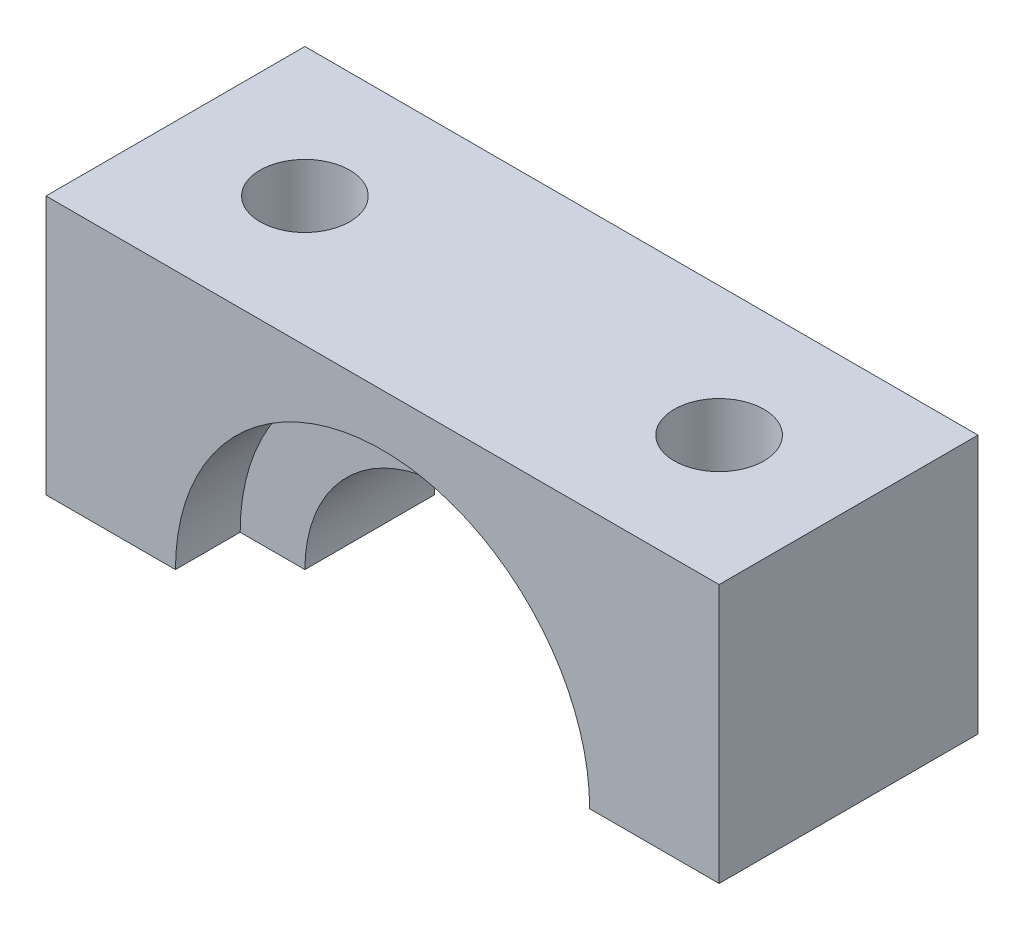
ISO-10303-21;
HEADER;
FILE_DESCRIPTION(('STEP AP214'),'2;1');
FILE_NAME('part.step','',(''),(''),'','','');
FILE_SCHEMA(('AUTOMOTIVE_DESIGN { 1 0 10303 214 1 1 1 1 }'));
ENDSEC;
DATA;
#1=APPLICATION_CONTEXT('core data for automotive mechanical design processes');
#2=APPLICATION_PROTOCOL_DEFINITION('international standard','automotive_design',2000,#1);
#3=PRODUCT_CONTEXT('',#1,'mechanical');
#4=PRODUCT('Part','Part','',(#3));
#5=PRODUCT_RELATED_PRODUCT_CATEGORY('part','',(#4));
#6=PRODUCT_DEFINITION_FORMATION('','',#4);
#7=PRODUCT_DEFINITION_CONTEXT('part definition',#1,'design');
#8=PRODUCT_DEFINITION('design','',#6,#7);
#9=PRODUCT_DEFINITION_SHAPE('','',#8);
#10=(LENGTH_UNIT() NAMED_UNIT(*) SI_UNIT(.MILLI.,.METRE.));
#11=(NAMED_UNIT(*) PLANE_ANGLE_UNIT() SI_UNIT($,.RADIAN.));
#12=(NAMED_UNIT(*) SI_UNIT($,.STERADIAN.) SOLID_ANGLE_UNIT());
#13=UNCERTAINTY_MEASURE_WITH_UNIT(LENGTH_MEASURE(1.E-05),#10,'distance_accuracy_value','');
#14=(GEOMETRIC_REPRESENTATION_CONTEXT(3) GLOBAL_UNCERTAINTY_ASSIGNED_CONTEXT((#13)) GLOBAL_UNIT_ASSIGNED_CONTEXT((#10,
#11,#12)) REPRESENTATION_CONTEXT('',''));
#15=CARTESIAN_POINT('',(0.,0.,0.));
#16=DIRECTION('',(0.,0.,1.));
#17=DIRECTION('',(1.,0.,0.));
#18=AXIS2_PLACEMENT_3D('',#15,#16,#17);
#19=CARTESIAN_POINT('',(0.,0.,2.5));
#20=DIRECTION('',(0.,0.,1.));
#21=DIRECTION('',(1.,0.,0.));
#22=AXIS2_PLACEMENT_3D('',#19,#20,#21);
#23=PLANE('',#22);
#24=DIRECTION('',(1.,0.,0.));
#25=VECTOR('',#24,1.);
#26=CARTESIAN_POINT('',(13.,0.,2.5));
#27=LINE('',#26,#25);
#28=CARTESIAN_POINT('',(5.5,0.,2.5));
#29=VERTEX_POINT('',#28);
#30=CARTESIAN_POINT('',(8.,0.,2.5));
#31=VERTEX_POINT('',#30);
#32=EDGE_CURVE('E55',#29,#31,#27,.T.);
#33=ORIENTED_EDGE('',*,*,#32,.T.);
#34=CARTESIAN_POINT('',(0.,0.,2.5));
#35=DIRECTION('',(0.,0.,1.));
#36=DIRECTION('',(1.,0.,0.));
#37=AXIS2_PLACEMENT_3D('',#34,#35,#36);
#38=CIRCLE('',#37,8.);
#39=CARTESIAN_POINT('',(-8.,0.,2.5));
#40=VERTEX_POINT('',#39);
#41=EDGE_CURVE('E50',#31,#40,#38,.T.);
#42=ORIENTED_EDGE('',*,*,#41,.T.);
#43=DIRECTION('',(1.,0.,0.));
#44=VECTOR('',#43,1.);
#45=CARTESIAN_POINT('',(-5.5,0.,2.5));
#46=LINE('',#45,#44);
#47=CARTESIAN_POINT('',(-5.5,0.,2.5));
#48=VERTEX_POINT('',#47);
#49=EDGE_CURVE('E174',#40,#48,#46,.T.);
#50=ORIENTED_EDGE('',*,*,#49,.T.);
#51=CARTESIAN_POINT('',(0.,0.,2.5));
#52=DIRECTION('',(0.,0.,-1.));
#53=DIRECTION('',(1.,0.,0.));
#54=AXIS2_PLACEMENT_3D('',#51,#52,#53);
#55=CIRCLE('',#54,5.5);
#56=EDGE_CURVE('E170',#48,#29,#55,.T.);
#57=ORIENTED_EDGE('',*,*,#56,.T.);
#58=EDGE_LOOP('',(#33,#42,#50,#57));
#59=FACE_BOUND('',#58,.T.);
#60=ADVANCED_FACE('F34',(#59),#23,.T.);
#61=CARTESIAN_POINT('',(0.,0.,-2.5));
#62=DIRECTION('',(0.,0.,1.));
#63=DIRECTION('',(1.,0.,0.));
#64=AXIS2_PLACEMENT_3D('',#61,#62,#63);
#65=PLANE('',#64);
#66=CARTESIAN_POINT('',(0.,0.,-2.5));
#67=DIRECTION('',(0.,0.,1.));
#68=DIRECTION('',(1.,0.,0.));
#69=AXIS2_PLACEMENT_3D('',#66,#67,#68);
#70=CIRCLE('',#69,8.);
#71=CARTESIAN_POINT('',(8.,0.,-2.5));
#72=VERTEX_POINT('',#71);
#73=CARTESIAN_POINT('',(-8.,0.,-2.5));
#74=VERTEX_POINT('',#73);
#75=EDGE_CURVE('E11',#72,#74,#70,.T.);
#76=ORIENTED_EDGE('',*,*,#75,.F.);
#77=DIRECTION('',(1.,0.,0.));
#78=VECTOR('',#77,1.);
#79=CARTESIAN_POINT('',(13.,0.,-2.5));
#80=LINE('',#79,#78);
#81=CARTESIAN_POINT('',(5.5,0.,-2.5));
#82=VERTEX_POINT('',#81);
#83=EDGE_CURVE('E179',#82,#72,#80,.T.);
#84=ORIENTED_EDGE('',*,*,#83,.F.);
#85=CARTESIAN_POINT('',(0.,0.,-2.5));
#86=DIRECTION('',(0.,0.,-1.));
#87=DIRECTION('',(1.,0.,0.));
#88=AXIS2_PLACEMENT_3D('',#85,#86,#87);
#89=CIRCLE('',#88,5.5);
#90=CARTESIAN_POINT('',(-5.5,0.,-2.5));
#91=VERTEX_POINT('',#90);
#92=EDGE_CURVE('E169',#91,#82,#89,.T.);
#93=ORIENTED_EDGE('',*,*,#92,.F.);
#94=DIRECTION('',(1.,0.,0.));
#95=VECTOR('',#94,1.);
#96=CARTESIAN_POINT('',(-5.5,0.,-2.5));
#97=LINE('',#96,#95);
#98=EDGE_CURVE('E172',#74,#91,#97,.T.);
#99=ORIENTED_EDGE('',*,*,#98,.F.);
#100=EDGE_LOOP('',(#76,#84,#93,#99));
#101=FACE_BOUND('',#100,.T.);
#102=ADVANCED_FACE('F200',(#101),#65,.F.);
#103=CARTESIAN_POINT('',(0.,0.,2.5));
#104=DIRECTION('',(0.,0.,-1.));
#105=DIRECTION('',(-1.,0.,0.));
#106=AXIS2_PLACEMENT_3D('',#103,#104,#105);
#107=CYLINDRICAL_SURFACE('',#106,5.5);
#108=ORIENTED_EDGE('',*,*,#92,.T.);
#109=DIRECTION('',(0.,0.,-1.));
#110=VECTOR('',#109,1.);
#111=CARTESIAN_POINT('',(5.5,0.,2.5));
#112=LINE('',#111,#110);
#113=EDGE_CURVE('E43',#29,#82,#112,.T.);
#114=ORIENTED_EDGE('',*,*,#113,.F.);
#115=ORIENTED_EDGE('',*,*,#56,.F.);
#116=DIRECTION('',(0.,0.,-1.));
#117=VECTOR('',#116,1.);
#118=CARTESIAN_POINT('',(-5.5,0.,2.5));
#119=LINE('',#118,#117);
#120=EDGE_CURVE('E176',#48,#91,#119,.T.);
#121=ORIENTED_EDGE('',*,*,#120,.T.);
#122=EDGE_LOOP('',(#108,#114,#115,#121));
#123=FACE_BOUND('',#122,.T.);
#124=ADVANCED_FACE('F36',(#123),#107,.F.);
#125=CARTESIAN_POINT('',(13.,0.,2.5));
#126=DIRECTION('',(0.,1.,0.));
#127=DIRECTION('',(-1.,0.,0.));
#128=AXIS2_PLACEMENT_3D('',#125,#126,#127);
#129=PLANE('',#128);
#130=CARTESIAN_POINT('',(8.,0.,0.));
#131=DIRECTION('',(0.,-1.,0.));
#132=DIRECTION('',(-1.,0.,0.));
#133=AXIS2_PLACEMENT_3D('',#130,#131,#132);
#134=CIRCLE('',#133,1.7309139379565);
#135=CARTESIAN_POINT('',(6.2690860620435,0.,0.));
#136=VERTEX_POINT('',#135);
#137=EDGE_CURVE('E353',#136,#136,#134,.T.);
#138=ORIENTED_EDGE('',*,*,#137,.F.);
#139=EDGE_LOOP('',(#138));
#140=FACE_BOUND('',#139,.T.);
#141=DIRECTION('',(0.,0.,-1.));
#142=VECTOR('',#141,1.);
#143=CARTESIAN_POINT('',(13.,0.,2.5));
#144=LINE('',#143,#142);
#145=CARTESIAN_POINT('',(13.,0.,5.));
#146=VERTEX_POINT('',#145);
#147=CARTESIAN_POINT('',(13.,0.,-5.));
#148=VERTEX_POINT('',#147);
#149=EDGE_CURVE('E187',#146,#148,#144,.T.);
#150=ORIENTED_EDGE('',*,*,#149,.F.);
#151=DIRECTION('',(1.,0.,0.));
#152=VECTOR('',#151,1.);
#153=CARTESIAN_POINT('',(8.,0.,5.));
#154=LINE('',#153,#152);
#155=CARTESIAN_POINT('',(8.,0.,5.));
#156=VERTEX_POINT('',#155);
#157=EDGE_CURVE('E146',#156,#146,#154,.T.);
#158=ORIENTED_EDGE('',*,*,#157,.F.);
#159=DIRECTION('',(0.,0.,-1.));
#160=VECTOR('',#159,1.);
#161=CARTESIAN_POINT('',(8.,0.,5.));
#162=LINE('',#161,#160);
#163=EDGE_CURVE('E161',#156,#31,#162,.T.);
#164=ORIENTED_EDGE('',*,*,#163,.T.);
#165=ORIENTED_EDGE('',*,*,#32,.F.);
#166=ORIENTED_EDGE('',*,*,#113,.T.);
#167=ORIENTED_EDGE('',*,*,#83,.T.);
#168=CARTESIAN_POINT('',(8.,0.,-5.));
#169=VERTEX_POINT('',#168);
#170=EDGE_CURVE('E149',#72,#169,#162,.T.);
#171=ORIENTED_EDGE('',*,*,#170,.T.);
#172=DIRECTION('',(1.,0.,0.));
#173=VECTOR('',#172,1.);
#174=CARTESIAN_POINT('',(8.,0.,-5.));
#175=LINE('',#174,#173);
#176=EDGE_CURVE('E137',#169,#148,#175,.T.);
#177=ORIENTED_EDGE('',*,*,#176,.T.);
#178=EDGE_LOOP('',(#150,#158,#164,#165,#166,#167,#171,#177));
#179=FACE_BOUND('',#178,.T.);
#180=ADVANCED_FACE('F192',(#140,#179),#129,.F.);
#181=CARTESIAN_POINT('',(13.,10.,2.5));
#182=DIRECTION('',(-1.,0.,0.));
#183=DIRECTION('',(0.,0.,1.));
#184=AXIS2_PLACEMENT_3D('',#181,#182,#183);
#185=PLANE('',#184);
#186=ORIENTED_EDGE('',*,*,#149,.T.);
#187=DIRECTION('',(0.,1.,0.));
#188=VECTOR('',#187,1.);
#189=CARTESIAN_POINT('',(13.,0.,-5.));
#190=LINE('',#189,#188);
#191=CARTESIAN_POINT('',(13.,10.,-5.));
#192=VERTEX_POINT('',#191);
#193=EDGE_CURVE('E134',#148,#192,#190,.T.);
#194=ORIENTED_EDGE('',*,*,#193,.T.);
#195=DIRECTION('',(0.,0.,-1.));
#196=VECTOR('',#195,1.);
#197=CARTESIAN_POINT('',(13.,10.,2.5));
#198=LINE('',#197,#196);
#199=CARTESIAN_POINT('',(13.,10.,5.));
#200=VERTEX_POINT('',#199);
#201=EDGE_CURVE('E119',#200,#192,#198,.T.);
#202=ORIENTED_EDGE('',*,*,#201,.F.);
#203=DIRECTION('',(0.,1.,0.));
#204=VECTOR('',#203,1.);
#205=CARTESIAN_POINT('',(13.,0.,5.));
#206=LINE('',#205,#204);
#207=EDGE_CURVE('E133',#146,#200,#206,.T.);
#208=ORIENTED_EDGE('',*,*,#207,.F.);
#209=EDGE_LOOP('',(#186,#194,#202,#208));
#210=FACE_BOUND('',#209,.T.);
#211=ADVANCED_FACE('F216',(#210),#185,.F.);
#212=CARTESIAN_POINT('',(-13.,10.,2.5));
#213=DIRECTION('',(0.,-1.,0.));
#214=DIRECTION('',(1.,0.,0.));
#215=AXIS2_PLACEMENT_3D('',#212,#213,#214);
#216=PLANE('',#215);
#217=CARTESIAN_POINT('',(8.,10.,0.));
#218=DIRECTION('',(0.,-1.,0.));
#219=DIRECTION('',(1.,0.,0.));
#220=AXIS2_PLACEMENT_3D('',#217,#218,#219);
#221=CIRCLE('',#220,1.7309139379565);
#222=CARTESIAN_POINT('',(9.7309139379565,10.,0.));
#223=VERTEX_POINT('',#222);
#224=EDGE_CURVE('E38',#223,#223,#221,.T.);
#225=ORIENTED_EDGE('',*,*,#224,.T.);
#226=EDGE_LOOP('',(#225));
#227=FACE_BOUND('',#226,.T.);
#228=CARTESIAN_POINT('',(-8.,10.,0.));
#229=DIRECTION('',(0.,-1.,0.));
#230=DIRECTION('',(1.,0.,0.));
#231=AXIS2_PLACEMENT_3D('',#228,#229,#230);
#232=CIRCLE('',#231,1.7309139379565);
#233=CARTESIAN_POINT('',(-6.26908606204351,10.,0.));
#234=VERTEX_POINT('',#233);
#235=EDGE_CURVE('E140',#234,#234,#232,.T.);
#236=ORIENTED_EDGE('',*,*,#235,.T.);
#237=EDGE_LOOP('',(#236));
#238=FACE_BOUND('',#237,.T.);
#239=ORIENTED_EDGE('',*,*,#201,.T.);
#240=DIRECTION('',(-1.,0.,0.));
#241=VECTOR('',#240,1.);
#242=CARTESIAN_POINT('',(13.,10.,-5.));
#243=LINE('',#242,#241);
#244=CARTESIAN_POINT('',(-13.,10.,-5.));
#245=VERTEX_POINT('',#244);
#246=EDGE_CURVE('E115',#192,#245,#243,.T.);
#247=ORIENTED_EDGE('',*,*,#246,.T.);
#248=DIRECTION('',(0.,0.,-1.));
#249=VECTOR('',#248,1.);
#250=CARTESIAN_POINT('',(-13.,10.,2.5));
#251=LINE('',#250,#249);
#252=CARTESIAN_POINT('',(-13.,10.,5.));
#253=VERTEX_POINT('',#252);
#254=EDGE_CURVE('E109',#253,#245,#251,.T.);
#255=ORIENTED_EDGE('',*,*,#254,.F.);
#256=DIRECTION('',(-1.,0.,0.));
#257=VECTOR('',#256,1.);
#258=CARTESIAN_POINT('',(13.,10.,5.));
#259=LINE('',#258,#257);
#260=EDGE_CURVE('E113',#200,#253,#259,.T.);
#261=ORIENTED_EDGE('',*,*,#260,.F.);
#262=EDGE_LOOP('',(#239,#247,#255,#261));
#263=FACE_BOUND('',#262,.T.);
#264=ADVANCED_FACE('F111',(#227,#238,#263),#216,.F.);
#265=CARTESIAN_POINT('',(-13.,0.,2.5));
#266=DIRECTION('',(1.,0.,0.));
#267=DIRECTION('',(0.,0.,-1.));
#268=AXIS2_PLACEMENT_3D('',#265,#266,#267);
#269=PLANE('',#268);
#270=ORIENTED_EDGE('',*,*,#254,.T.);
#271=DIRECTION('',(0.,-1.,0.));
#272=VECTOR('',#271,1.);
#273=CARTESIAN_POINT('',(-13.,10.,-5.));
#274=LINE('',#273,#272);
#275=CARTESIAN_POINT('',(-13.,0.,-5.));
#276=VERTEX_POINT('',#275);
#277=EDGE_CURVE('E151',#245,#276,#274,.T.);
#278=ORIENTED_EDGE('',*,*,#277,.T.);
#279=DIRECTION('',(0.,0.,-1.));
#280=VECTOR('',#279,1.);
#281=CARTESIAN_POINT('',(-13.,0.,2.5));
#282=LINE('',#281,#280);
#283=CARTESIAN_POINT('',(-13.,0.,5.));
#284=VERTEX_POINT('',#283);
#285=EDGE_CURVE('E120',#284,#276,#282,.T.);
#286=ORIENTED_EDGE('',*,*,#285,.F.);
#287=DIRECTION('',(0.,-1.,0.));
#288=VECTOR('',#287,1.);
#289=CARTESIAN_POINT('',(-13.,10.,5.));
#290=LINE('',#289,#288);
#291=EDGE_CURVE('E123',#253,#284,#290,.T.);
#292=ORIENTED_EDGE('',*,*,#291,.F.);
#293=EDGE_LOOP('',(#270,#278,#286,#292));
#294=FACE_BOUND('',#293,.T.);
#295=ADVANCED_FACE('F124',(#294),#269,.F.);
#296=CARTESIAN_POINT('',(-5.5,0.,2.5));
#297=DIRECTION('',(0.,1.,0.));
#298=DIRECTION('',(-1.,0.,0.));
#299=AXIS2_PLACEMENT_3D('',#296,#297,#298);
#300=PLANE('',#299);
#301=CARTESIAN_POINT('',(-8.,0.,0.));
#302=DIRECTION('',(0.,-1.,0.));
#303=DIRECTION('',(1.,0.,0.));
#304=AXIS2_PLACEMENT_3D('',#301,#302,#303);
#305=CIRCLE('',#304,1.7309139379565);
#306=CARTESIAN_POINT('',(-6.2690860620435,0.,0.));
#307=VERTEX_POINT('',#306);
#308=EDGE_CURVE('E356',#307,#307,#305,.T.);
#309=ORIENTED_EDGE('',*,*,#308,.F.);
#310=EDGE_LOOP('',(#309));
#311=FACE_BOUND('',#310,.T.);
#312=ORIENTED_EDGE('',*,*,#285,.T.);
#313=DIRECTION('',(1.,0.,0.));
#314=VECTOR('',#313,1.);
#315=CARTESIAN_POINT('',(-13.,0.,-5.));
#316=LINE('',#315,#314);
#317=CARTESIAN_POINT('',(-8.,0.,-5.));
#318=VERTEX_POINT('',#317);
#319=EDGE_CURVE('E153',#276,#318,#316,.T.);
#320=ORIENTED_EDGE('',*,*,#319,.T.);
#321=DIRECTION('',(0.,0.,-1.));
#322=VECTOR('',#321,1.);
#323=CARTESIAN_POINT('',(-8.,0.,5.));
#324=LINE('',#323,#322);
#325=EDGE_CURVE('E164',#74,#318,#324,.T.);
#326=ORIENTED_EDGE('',*,*,#325,.F.);
#327=ORIENTED_EDGE('',*,*,#98,.T.);
#328=ORIENTED_EDGE('',*,*,#120,.F.);
#329=ORIENTED_EDGE('',*,*,#49,.F.);
#330=CARTESIAN_POINT('',(-8.,0.,5.));
#331=VERTEX_POINT('',#330);
#332=EDGE_CURVE('E165',#331,#40,#324,.T.);
#333=ORIENTED_EDGE('',*,*,#332,.F.);
#334=DIRECTION('',(1.,0.,0.));
#335=VECTOR('',#334,1.);
#336=CARTESIAN_POINT('',(-13.,0.,5.));
#337=LINE('',#336,#335);
#338=EDGE_CURVE('E127',#284,#331,#337,.T.);
#339=ORIENTED_EDGE('',*,*,#338,.F.);
#340=EDGE_LOOP('',(#312,#320,#326,#327,#328,#329,#333,#339));
#341=FACE_BOUND('',#340,.T.);
#342=ADVANCED_FACE('F205',(#311,#341),#300,.F.);
#343=CARTESIAN_POINT('',(0.,0.,-5.));
#344=DIRECTION('',(0.,0.,1.));
#345=DIRECTION('',(1.,0.,0.));
#346=AXIS2_PLACEMENT_3D('',#343,#344,#345);
#347=PLANE('',#346);
#348=ORIENTED_EDGE('',*,*,#246,.F.);
#349=ORIENTED_EDGE('',*,*,#193,.F.);
#350=ORIENTED_EDGE('',*,*,#176,.F.);
#351=CARTESIAN_POINT('',(0.,0.,-5.));
#352=DIRECTION('',(0.,0.,-1.));
#353=DIRECTION('',(1.,0.,0.));
#354=AXIS2_PLACEMENT_3D('',#351,#352,#353);
#355=CIRCLE('',#354,8.);
#356=EDGE_CURVE('E156',#318,#169,#355,.T.);
#357=ORIENTED_EDGE('',*,*,#356,.F.);
#358=ORIENTED_EDGE('',*,*,#319,.F.);
#359=ORIENTED_EDGE('',*,*,#277,.F.);
#360=EDGE_LOOP('',(#348,#349,#350,#357,#358,#359));
#361=FACE_BOUND('',#360,.T.);
#362=ADVANCED_FACE('F210',(#361),#347,.F.);
#363=CARTESIAN_POINT('',(0.,0.,5.));
#364=DIRECTION('',(0.,0.,-1.));
#365=DIRECTION('',(-1.,0.,0.));
#366=AXIS2_PLACEMENT_3D('',#363,#364,#365);
#367=CYLINDRICAL_SURFACE('',#366,8.);
#368=ORIENTED_EDGE('',*,*,#170,.F.);
#369=ORIENTED_EDGE('',*,*,#75,.T.);
#370=ORIENTED_EDGE('',*,*,#325,.T.);
#371=ORIENTED_EDGE('',*,*,#356,.T.);
#372=EDGE_LOOP('',(#368,#369,#370,#371));
#373=FACE_BOUND('',#372,.T.);
#374=ADVANCED_FACE('F203',(#373),#367,.F.);
#375=ORIENTED_EDGE('',*,*,#41,.F.);
#376=ORIENTED_EDGE('',*,*,#163,.F.);
#377=CARTESIAN_POINT('',(0.,0.,5.));
#378=DIRECTION('',(0.,0.,-1.));
#379=DIRECTION('',(1.,0.,0.));
#380=AXIS2_PLACEMENT_3D('',#377,#378,#379);
#381=CIRCLE('',#380,8.);
#382=EDGE_CURVE('E144',#331,#156,#381,.T.);
#383=ORIENTED_EDGE('',*,*,#382,.F.);
#384=ORIENTED_EDGE('',*,*,#332,.T.);
#385=EDGE_LOOP('',(#375,#376,#383,#384));
#386=FACE_BOUND('',#385,.T.);
#387=ADVANCED_FACE('F233',(#386),#367,.F.);
#388=CARTESIAN_POINT('',(0.,0.,5.));
#389=DIRECTION('',(0.,0.,1.));
#390=DIRECTION('',(1.,0.,0.));
#391=AXIS2_PLACEMENT_3D('',#388,#389,#390);
#392=PLANE('',#391);
#393=ORIENTED_EDGE('',*,*,#260,.T.);
#394=ORIENTED_EDGE('',*,*,#291,.T.);
#395=ORIENTED_EDGE('',*,*,#338,.T.);
#396=ORIENTED_EDGE('',*,*,#382,.T.);
#397=ORIENTED_EDGE('',*,*,#157,.T.);
#398=ORIENTED_EDGE('',*,*,#207,.T.);
#399=EDGE_LOOP('',(#393,#394,#395,#396,#397,#398));
#400=FACE_BOUND('',#399,.T.);
#401=ADVANCED_FACE('F130',(#400),#392,.T.);
#402=CARTESIAN_POINT('',(-8.,15.,0.));
#403=DIRECTION('',(0.,-1.,0.));
#404=DIRECTION('',(1.,0.,0.));
#405=AXIS2_PLACEMENT_3D('',#402,#403,#404);
#406=CYLINDRICAL_SURFACE('',#405,1.7309139379565);
#407=ORIENTED_EDGE('',*,*,#308,.T.);
#408=EDGE_LOOP('',(#407));
#409=FACE_BOUND('',#408,.T.);
#410=ORIENTED_EDGE('',*,*,#235,.F.);
#411=EDGE_LOOP('',(#410));
#412=FACE_BOUND('',#411,.T.);
#413=ADVANCED_FACE('F271',(#409,#412),#406,.F.);
#414=CARTESIAN_POINT('',(8.,15.,0.));
#415=DIRECTION('',(0.,-1.,0.));
#416=DIRECTION('',(1.,0.,0.));
#417=AXIS2_PLACEMENT_3D('',#414,#415,#416);
#418=CYLINDRICAL_SURFACE('',#417,1.7309139379565);
#419=ORIENTED_EDGE('',*,*,#137,.T.);
#420=EDGE_LOOP('',(#419));
#421=FACE_BOUND('',#420,.T.);
#422=ORIENTED_EDGE('',*,*,#224,.F.);
#423=EDGE_LOOP('',(#422));
#424=FACE_BOUND('',#423,.T.);
#425=ADVANCED_FACE('F278',(#421,#424),#418,.F.);
#426=CLOSED_SHELL('',(#60,#102,#124,#180,#211,#264,#295,#342,#362,#374,#387,#401,#413,#425));
#427=MANIFOLD_SOLID_BREP('B2',#426);
#428=ADVANCED_BREP_SHAPE_REPRESENTATION('',(#18,#427),#14);
#429=SHAPE_DEFINITION_REPRESENTATION(#9,#428);
ENDSEC;
END-ISO-10303-21;
